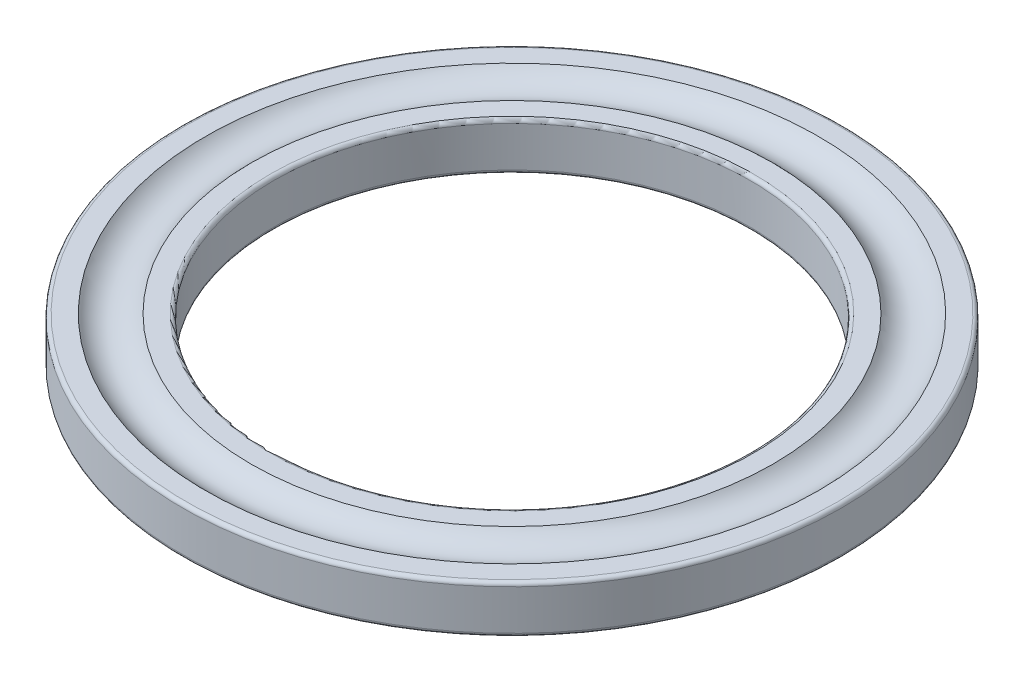
ISO-10303-21;
HEADER;
FILE_DESCRIPTION(('STEP AP214'),'2;1');
FILE_NAME('part.step','',(''),(''),'','','');
FILE_SCHEMA(('AUTOMOTIVE_DESIGN { 1 0 10303 214 1 1 1 1 }'));
ENDSEC;
DATA;
#1=APPLICATION_CONTEXT('core data for automotive mechanical design processes');
#2=APPLICATION_PROTOCOL_DEFINITION('international standard','automotive_design',2000,#1);
#3=PRODUCT_CONTEXT('',#1,'mechanical');
#4=PRODUCT('Part','Part','',(#3));
#5=PRODUCT_RELATED_PRODUCT_CATEGORY('part','',(#4));
#6=PRODUCT_DEFINITION_FORMATION('','',#4);
#7=PRODUCT_DEFINITION_CONTEXT('part definition',#1,'design');
#8=PRODUCT_DEFINITION('design','',#6,#7);
#9=PRODUCT_DEFINITION_SHAPE('','',#8);
#10=(LENGTH_UNIT() NAMED_UNIT(*) SI_UNIT(.MILLI.,.METRE.));
#11=(NAMED_UNIT(*) PLANE_ANGLE_UNIT() SI_UNIT($,.RADIAN.));
#12=(NAMED_UNIT(*) SI_UNIT($,.STERADIAN.) SOLID_ANGLE_UNIT());
#13=UNCERTAINTY_MEASURE_WITH_UNIT(LENGTH_MEASURE(1.E-05),#10,'distance_accuracy_value','');
#14=(GEOMETRIC_REPRESENTATION_CONTEXT(3) GLOBAL_UNCERTAINTY_ASSIGNED_CONTEXT((#13)) GLOBAL_UNIT_ASSIGNED_CONTEXT((#10,
#11,#12)) REPRESENTATION_CONTEXT('',''));
#15=CARTESIAN_POINT('',(0.,0.,0.));
#16=DIRECTION('',(0.,0.,1.));
#17=DIRECTION('',(1.,0.,0.));
#18=AXIS2_PLACEMENT_3D('',#15,#16,#17);
#19=CARTESIAN_POINT('',(0.,0.,0.));
#20=DIRECTION('',(0.,-1.,0.));
#21=DIRECTION('',(1.,0.,0.));
#22=AXIS2_PLACEMENT_3D('',#19,#20,#21);
#23=CYLINDRICAL_SURFACE('',#22,32.5);
#24=CARTESIAN_POINT('',(0.,0.5,0.));
#25=DIRECTION('',(0.,-1.,0.));
#26=DIRECTION('',(1.,0.,0.));
#27=AXIS2_PLACEMENT_3D('',#24,#25,#26);
#28=CIRCLE('',#27,32.5);
#29=CARTESIAN_POINT('',(32.5,0.5,0.));
#30=VERTEX_POINT('',#29);
#31=EDGE_CURVE('E56',#30,#30,#28,.T.);
#32=ORIENTED_EDGE('',*,*,#31,.T.);
#33=EDGE_LOOP('',(#32));
#34=FACE_BOUND('',#33,.T.);
#35=CARTESIAN_POINT('',(0.,6.,0.));
#36=DIRECTION('',(0.,1.,0.));
#37=DIRECTION('',(-1.,0.,0.));
#38=AXIS2_PLACEMENT_3D('',#35,#36,#37);
#39=CIRCLE('',#38,32.5);
#40=CARTESIAN_POINT('',(-32.5,6.,0.));
#41=VERTEX_POINT('',#40);
#42=EDGE_CURVE('E59',#41,#41,#39,.T.);
#43=ORIENTED_EDGE('',*,*,#42,.T.);
#44=EDGE_LOOP('',(#43));
#45=FACE_BOUND('',#44,.T.);
#46=ADVANCED_FACE('F30',(#34,#45),#23,.F.);
#47=CARTESIAN_POINT('',(32.5,0.,0.));
#48=DIRECTION('',(0.,-1.,0.));
#49=DIRECTION('',(1.,0.,0.));
#50=AXIS2_PLACEMENT_3D('',#47,#48,#49);
#51=PLANE('',#50);
#52=CARTESIAN_POINT('',(0.,0.,0.));
#53=DIRECTION('',(0.,-1.,0.));
#54=DIRECTION('',(1.,0.,0.));
#55=AXIS2_PLACEMENT_3D('',#52,#53,#54);
#56=CIRCLE('',#55,33.);
#57=CARTESIAN_POINT('',(33.,0.,0.));
#58=VERTEX_POINT('',#57);
#59=EDGE_CURVE('E50',#58,#58,#56,.F.);
#60=ORIENTED_EDGE('',*,*,#59,.T.);
#61=EDGE_LOOP('',(#60));
#62=FACE_BOUND('',#61,.T.);
#63=CARTESIAN_POINT('',(0.,0.,0.));
#64=DIRECTION('',(0.,-1.,0.));
#65=DIRECTION('',(1.,0.,0.));
#66=AXIS2_PLACEMENT_3D('',#63,#64,#65);
#67=CIRCLE('',#66,44.5);
#68=CARTESIAN_POINT('',(44.5,0.,0.));
#69=VERTEX_POINT('',#68);
#70=EDGE_CURVE('E53',#69,#69,#67,.T.);
#71=ORIENTED_EDGE('',*,*,#70,.T.);
#72=EDGE_LOOP('',(#71));
#73=FACE_BOUND('',#72,.T.);
#74=ADVANCED_FACE('F86',(#62,#73),#51,.T.);
#75=CARTESIAN_POINT('',(0.,0.,0.));
#76=DIRECTION('',(0.,-1.,0.));
#77=DIRECTION('',(1.,0.,0.));
#78=AXIS2_PLACEMENT_3D('',#75,#76,#77);
#79=CYLINDRICAL_SURFACE('',#78,45.);
#80=CARTESIAN_POINT('',(0.,0.5,0.));
#81=DIRECTION('',(0.,-1.,0.));
#82=DIRECTION('',(1.,0.,0.));
#83=AXIS2_PLACEMENT_3D('',#80,#81,#82);
#84=CIRCLE('',#83,45.);
#85=CARTESIAN_POINT('',(45.,0.5,0.));
#86=VERTEX_POINT('',#85);
#87=EDGE_CURVE('E41',#86,#86,#84,.F.);
#88=ORIENTED_EDGE('',*,*,#87,.T.);
#89=EDGE_LOOP('',(#88));
#90=FACE_BOUND('',#89,.T.);
#91=CARTESIAN_POINT('',(0.,6.00000000000001,0.));
#92=DIRECTION('',(0.,1.,0.));
#93=DIRECTION('',(-1.,0.,0.));
#94=AXIS2_PLACEMENT_3D('',#91,#92,#93);
#95=CIRCLE('',#94,45.);
#96=CARTESIAN_POINT('',(-45.,6.00000000000001,0.));
#97=VERTEX_POINT('',#96);
#98=EDGE_CURVE('E45',#97,#97,#95,.F.);
#99=ORIENTED_EDGE('',*,*,#98,.T.);
#100=EDGE_LOOP('',(#99));
#101=FACE_BOUND('',#100,.T.);
#102=ADVANCED_FACE('F92',(#90,#101),#79,.T.);
#103=CARTESIAN_POINT('',(45.,6.50000000000001,0.));
#104=DIRECTION('',(0.,1.,0.));
#105=DIRECTION('',(-1.,0.,0.));
#106=AXIS2_PLACEMENT_3D('',#103,#104,#105);
#107=PLANE('',#106);
#108=CARTESIAN_POINT('',(0.,6.50000000000001,0.));
#109=DIRECTION('',(0.,1.,0.));
#110=DIRECTION('',(-1.,0.,0.));
#111=AXIS2_PLACEMENT_3D('',#108,#109,#110);
#112=CIRCLE('',#111,44.5);
#113=CARTESIAN_POINT('',(-44.5,6.50000000000001,0.));
#114=VERTEX_POINT('',#113);
#115=EDGE_CURVE('E37',#114,#114,#112,.T.);
#116=ORIENTED_EDGE('',*,*,#115,.T.);
#117=EDGE_LOOP('',(#116));
#118=FACE_BOUND('',#117,.T.);
#119=CARTESIAN_POINT('',(0.,6.5,0.));
#120=DIRECTION('',(0.,-1.,0.));
#121=DIRECTION('',(1.,0.,0.));
#122=AXIS2_PLACEMENT_3D('',#119,#120,#121);
#123=CIRCLE('',#122,41.8724989991992);
#124=CARTESIAN_POINT('',(41.8724989991992,6.5,0.));
#125=VERTEX_POINT('',#124);
#126=EDGE_CURVE('E62',#125,#125,#123,.T.);
#127=ORIENTED_EDGE('',*,*,#126,.T.);
#128=EDGE_LOOP('',(#127));
#129=FACE_BOUND('',#128,.T.);
#130=ADVANCED_FACE('F83',(#118,#129),#107,.T.);
#131=CARTESIAN_POINT('',(0.,9.,0.));
#132=DIRECTION('',(0.,-1.,0.));
#133=DIRECTION('',(1.,0.,0.));
#134=AXIS2_PLACEMENT_3D('',#131,#132,#133);
#135=TOROIDAL_SURFACE('',#134,38.75,4.);
#136=CARTESIAN_POINT('',(0.,6.5,0.));
#137=DIRECTION('',(0.,-1.,0.));
#138=DIRECTION('',(1.,0.,0.));
#139=AXIS2_PLACEMENT_3D('',#136,#137,#138);
#140=CIRCLE('',#139,35.6275010008008);
#141=CARTESIAN_POINT('',(35.6275010008008,6.5,0.));
#142=VERTEX_POINT('',#141);
#143=EDGE_CURVE('E65',#142,#142,#140,.T.);
#144=ORIENTED_EDGE('',*,*,#143,.T.);
#145=EDGE_LOOP('',(#144));
#146=FACE_BOUND('',#145,.T.);
#147=ORIENTED_EDGE('',*,*,#126,.F.);
#148=EDGE_LOOP('',(#147));
#149=FACE_BOUND('',#148,.T.);
#150=ADVANCED_FACE('F69',(#146,#149),#135,.F.);
#151=CARTESIAN_POINT('',(35.6275010008008,6.5,0.));
#152=DIRECTION('',(0.,1.,0.));
#153=DIRECTION('',(-1.,0.,0.));
#154=AXIS2_PLACEMENT_3D('',#151,#152,#153);
#155=PLANE('',#154);
#156=CARTESIAN_POINT('',(0.,6.5,0.));
#157=DIRECTION('',(0.,1.,0.));
#158=DIRECTION('',(-1.,0.,0.));
#159=AXIS2_PLACEMENT_3D('',#156,#157,#158);
#160=CIRCLE('',#159,33.);
#161=CARTESIAN_POINT('',(-33.,6.5,0.));
#162=VERTEX_POINT('',#161);
#163=EDGE_CURVE('E10',#162,#162,#160,.F.);
#164=ORIENTED_EDGE('',*,*,#163,.T.);
#165=EDGE_LOOP('',(#164));
#166=FACE_BOUND('',#165,.T.);
#167=ORIENTED_EDGE('',*,*,#143,.F.);
#168=EDGE_LOOP('',(#167));
#169=FACE_BOUND('',#168,.T.);
#170=ADVANCED_FACE('F72',(#166,#169),#155,.T.);
#171=CARTESIAN_POINT('',(0.,0.5,0.));
#172=DIRECTION('',(0.,-1.,0.));
#173=DIRECTION('',(1.,0.,0.));
#174=AXIS2_PLACEMENT_3D('',#171,#172,#173);
#175=TOROIDAL_SURFACE('',#174,33.,0.5);
#176=ORIENTED_EDGE('',*,*,#59,.F.);
#177=EDGE_LOOP('',(#176));
#178=FACE_BOUND('',#177,.T.);
#179=ORIENTED_EDGE('',*,*,#31,.F.);
#180=EDGE_LOOP('',(#179));
#181=FACE_BOUND('',#180,.T.);
#182=ADVANCED_FACE('F74',(#178,#181),#175,.T.);
#183=CARTESIAN_POINT('',(0.,0.5,0.));
#184=DIRECTION('',(0.,-1.,0.));
#185=DIRECTION('',(1.,0.,0.));
#186=AXIS2_PLACEMENT_3D('',#183,#184,#185);
#187=TOROIDAL_SURFACE('',#186,44.5,0.5);
#188=ORIENTED_EDGE('',*,*,#87,.F.);
#189=EDGE_LOOP('',(#188));
#190=FACE_BOUND('',#189,.T.);
#191=ORIENTED_EDGE('',*,*,#70,.F.);
#192=EDGE_LOOP('',(#191));
#193=FACE_BOUND('',#192,.T.);
#194=ADVANCED_FACE('F80',(#190,#193),#187,.T.);
#195=CARTESIAN_POINT('',(0.,6.00000000000001,0.));
#196=DIRECTION('',(0.,1.,0.));
#197=DIRECTION('',(-1.,0.,0.));
#198=AXIS2_PLACEMENT_3D('',#195,#196,#197);
#199=TOROIDAL_SURFACE('',#198,44.5,0.5);
#200=ORIENTED_EDGE('',*,*,#115,.F.);
#201=EDGE_LOOP('',(#200));
#202=FACE_BOUND('',#201,.T.);
#203=ORIENTED_EDGE('',*,*,#98,.F.);
#204=EDGE_LOOP('',(#203));
#205=FACE_BOUND('',#204,.T.);
#206=ADVANCED_FACE('F99',(#202,#205),#199,.T.);
#207=CARTESIAN_POINT('',(0.,6.,0.));
#208=DIRECTION('',(0.,1.,0.));
#209=DIRECTION('',(-1.,0.,0.));
#210=AXIS2_PLACEMENT_3D('',#207,#208,#209);
#211=TOROIDAL_SURFACE('',#210,33.,0.5);
#212=ORIENTED_EDGE('',*,*,#42,.F.);
#213=EDGE_LOOP('',(#212));
#214=FACE_BOUND('',#213,.T.);
#215=ORIENTED_EDGE('',*,*,#163,.F.);
#216=EDGE_LOOP('',(#215));
#217=FACE_BOUND('',#216,.T.);
#218=ADVANCED_FACE('F32',(#214,#217),#211,.T.);
#219=CLOSED_SHELL('',(#46,#74,#102,#130,#150,#170,#182,#194,#206,#218));
#220=MANIFOLD_SOLID_BREP('B2',#219);
#221=ADVANCED_BREP_SHAPE_REPRESENTATION('',(#18,#220),#14);
#222=SHAPE_DEFINITION_REPRESENTATION(#9,#221);
ENDSEC;
END-ISO-10303-21;
